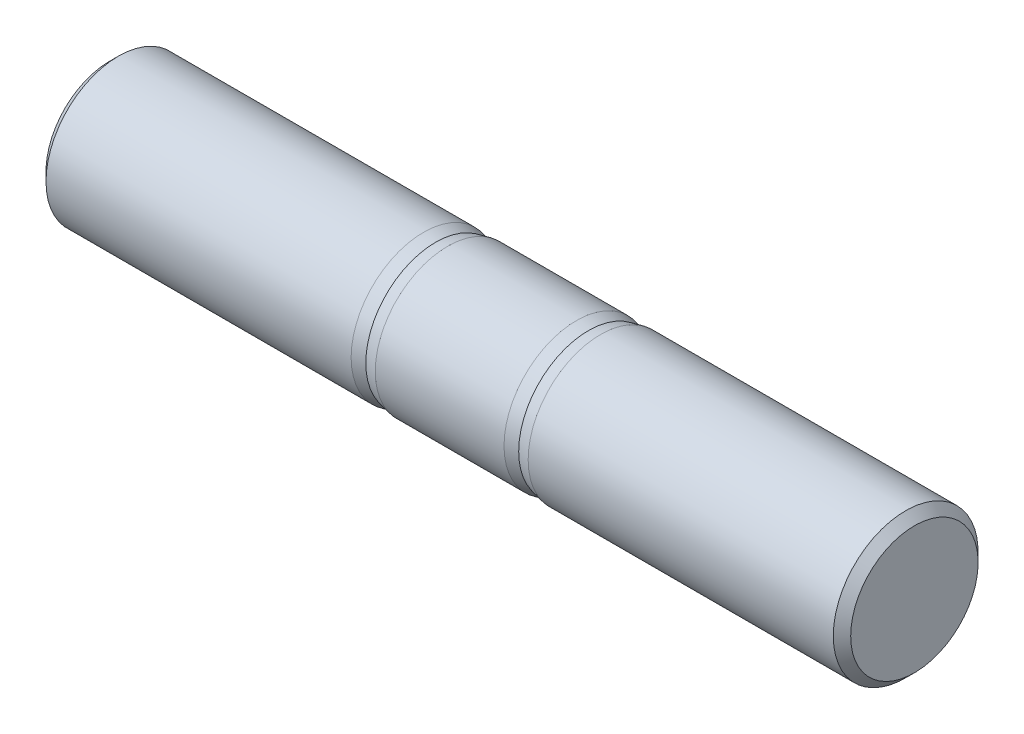
ISO-10303-21;
HEADER;
FILE_DESCRIPTION(('STEP AP214'),'2;1');
FILE_NAME('part.step','',(''),(''),'','','');
FILE_SCHEMA(('AUTOMOTIVE_DESIGN { 1 0 10303 214 1 1 1 1 }'));
ENDSEC;
DATA;
#1=APPLICATION_CONTEXT('core data for automotive mechanical design processes');
#2=APPLICATION_PROTOCOL_DEFINITION('international standard','automotive_design',2000,#1);
#3=PRODUCT_CONTEXT('',#1,'mechanical');
#4=PRODUCT('Part','Part','',(#3));
#5=PRODUCT_RELATED_PRODUCT_CATEGORY('part','',(#4));
#6=PRODUCT_DEFINITION_FORMATION('','',#4);
#7=PRODUCT_DEFINITION_CONTEXT('part definition',#1,'design');
#8=PRODUCT_DEFINITION('design','',#6,#7);
#9=PRODUCT_DEFINITION_SHAPE('','',#8);
#10=(LENGTH_UNIT() NAMED_UNIT(*) SI_UNIT(.MILLI.,.METRE.));
#11=(NAMED_UNIT(*) PLANE_ANGLE_UNIT() SI_UNIT($,.RADIAN.));
#12=(NAMED_UNIT(*) SI_UNIT($,.STERADIAN.) SOLID_ANGLE_UNIT());
#13=UNCERTAINTY_MEASURE_WITH_UNIT(LENGTH_MEASURE(1.E-05),#10,'distance_accuracy_value','');
#14=(GEOMETRIC_REPRESENTATION_CONTEXT(3) GLOBAL_UNCERTAINTY_ASSIGNED_CONTEXT((#13)) GLOBAL_UNIT_ASSIGNED_CONTEXT((#10,
#11,#12)) REPRESENTATION_CONTEXT('',''));
#15=CARTESIAN_POINT('',(0.,0.,0.));
#16=DIRECTION('',(0.,0.,1.));
#17=DIRECTION('',(1.,0.,0.));
#18=AXIS2_PLACEMENT_3D('',#15,#16,#17);
#19=CARTESIAN_POINT('',(84.,0.,0.));
#20=DIRECTION('',(-1.,0.,0.));
#21=DIRECTION('',(0.,0.,1.));
#22=AXIS2_PLACEMENT_3D('',#19,#20,#21);
#23=CONICAL_SURFACE('',#22,16.701,0.213209443242072);
#24=CARTESIAN_POINT('',(78.,0.,0.));
#25=DIRECTION('',(-1.,0.,0.));
#26=DIRECTION('',(0.,0.,1.));
#27=AXIS2_PLACEMENT_3D('',#24,#25,#26);
#28=CIRCLE('',#27,18.);
#29=CARTESIAN_POINT('',(78.,0.,18.));
#30=VERTEX_POINT('',#29);
#31=EDGE_CURVE('E58',#30,#30,#28,.T.);
#32=ORIENTED_EDGE('',*,*,#31,.F.);
#33=EDGE_LOOP('',(#32));
#34=FACE_BOUND('',#33,.T.);
#35=CARTESIAN_POINT('',(81.,0.,0.));
#36=DIRECTION('',(1.,0.,0.));
#37=DIRECTION('',(0.,0.,-1.));
#38=AXIS2_PLACEMENT_3D('',#35,#36,#37);
#39=CIRCLE('',#38,17.3505);
#40=CARTESIAN_POINT('',(81.,0.,-17.3505));
#41=VERTEX_POINT('',#40);
#42=EDGE_CURVE('E10',#41,#41,#39,.T.);
#43=ORIENTED_EDGE('',*,*,#42,.F.);
#44=EDGE_LOOP('',(#43));
#45=FACE_BOUND('',#44,.T.);
#46=ADVANCED_FACE('F32',(#34,#45),#23,.T.);
#47=CARTESIAN_POINT('',(0.,0.,0.));
#48=DIRECTION('',(1.,0.,0.));
#49=DIRECTION('',(0.,0.,-1.));
#50=AXIS2_PLACEMENT_3D('',#47,#48,#49);
#51=PLANE('',#50);
#52=CARTESIAN_POINT('',(0.,0.,0.));
#53=DIRECTION('',(1.,0.,0.));
#54=DIRECTION('',(0.,0.,-1.));
#55=AXIS2_PLACEMENT_3D('',#52,#53,#54);
#56=CIRCLE('',#55,15.835);
#57=CARTESIAN_POINT('',(0.,0.,-15.835));
#58=VERTEX_POINT('',#57);
#59=EDGE_CURVE('E55',#58,#58,#56,.F.);
#60=ORIENTED_EDGE('',*,*,#59,.T.);
#61=EDGE_LOOP('',(#60));
#62=FACE_BOUND('',#61,.T.);
#63=ADVANCED_FACE('F88',(#62),#51,.F.);
#64=CARTESIAN_POINT('',(-1.31084166351941,0.,0.));
#65=DIRECTION('',(-1.,0.,0.));
#66=DIRECTION('',(0.,0.,1.));
#67=AXIS2_PLACEMENT_3D('',#64,#65,#66);
#68=CYLINDRICAL_SURFACE('',#67,18.);
#69=CARTESIAN_POINT('',(2.16500000000003,0.,0.));
#70=DIRECTION('',(1.,0.,0.));
#71=DIRECTION('',(0.,0.,-1.));
#72=AXIS2_PLACEMENT_3D('',#69,#70,#71);
#73=CIRCLE('',#72,18.);
#74=CARTESIAN_POINT('',(2.16500000000003,0.,-18.));
#75=VERTEX_POINT('',#74);
#76=EDGE_CURVE('E52',#75,#75,#73,.T.);
#77=ORIENTED_EDGE('',*,*,#76,.T.);
#78=EDGE_LOOP('',(#77));
#79=FACE_BOUND('',#78,.T.);
#80=ORIENTED_EDGE('',*,*,#31,.T.);
#81=EDGE_LOOP('',(#80));
#82=FACE_BOUND('',#81,.T.);
#83=ADVANCED_FACE('F94',(#79,#82),#68,.T.);
#84=CARTESIAN_POINT('',(0.,0.,0.));
#85=DIRECTION('',(1.,0.,0.));
#86=DIRECTION('',(0.,0.,-1.));
#87=AXIS2_PLACEMENT_3D('',#84,#85,#86);
#88=CONICAL_SURFACE('',#87,15.835,0.785398163397443);
#89=ORIENTED_EDGE('',*,*,#76,.F.);
#90=EDGE_LOOP('',(#89));
#91=FACE_BOUND('',#90,.T.);
#92=ORIENTED_EDGE('',*,*,#59,.F.);
#93=EDGE_LOOP('',(#92));
#94=FACE_BOUND('',#93,.T.);
#95=ADVANCED_FACE('F84',(#91,#94),#88,.T.);
#96=CARTESIAN_POINT('',(84.,0.,0.));
#97=DIRECTION('',(1.,0.,0.));
#98=DIRECTION('',(0.,0.,-1.));
#99=AXIS2_PLACEMENT_3D('',#96,#97,#98);
#100=CONICAL_SURFACE('',#99,18.,0.213209443242074);
#101=CARTESIAN_POINT('',(84.,0.,0.));
#102=DIRECTION('',(-1.,0.,0.));
#103=DIRECTION('',(0.,0.,1.));
#104=AXIS2_PLACEMENT_3D('',#101,#102,#103);
#105=CIRCLE('',#104,18.);
#106=CARTESIAN_POINT('',(84.,0.,18.));
#107=VERTEX_POINT('',#106);
#108=EDGE_CURVE('E64',#107,#107,#105,.T.);
#109=ORIENTED_EDGE('',*,*,#108,.T.);
#110=EDGE_LOOP('',(#109));
#111=FACE_BOUND('',#110,.T.);
#112=ORIENTED_EDGE('',*,*,#42,.T.);
#113=EDGE_LOOP('',(#112));
#114=FACE_BOUND('',#113,.T.);
#115=ADVANCED_FACE('F75',(#111,#114),#100,.T.);
#116=CARTESIAN_POINT('',(122.,0.,0.));
#117=DIRECTION('',(-1.,0.,0.));
#118=DIRECTION('',(0.,0.,1.));
#119=AXIS2_PLACEMENT_3D('',#116,#117,#118);
#120=CONICAL_SURFACE('',#119,16.701,0.213209443242073);
#121=CARTESIAN_POINT('',(116.,0.,0.));
#122=DIRECTION('',(-1.,0.,0.));
#123=DIRECTION('',(0.,0.,1.));
#124=AXIS2_PLACEMENT_3D('',#121,#122,#123);
#125=CIRCLE('',#124,18.);
#126=CARTESIAN_POINT('',(116.,0.,18.));
#127=VERTEX_POINT('',#126);
#128=EDGE_CURVE('E67',#127,#127,#125,.T.);
#129=ORIENTED_EDGE('',*,*,#128,.F.);
#130=EDGE_LOOP('',(#129));
#131=FACE_BOUND('',#130,.T.);
#132=CARTESIAN_POINT('',(119.,0.,0.));
#133=DIRECTION('',(-1.,0.,0.));
#134=DIRECTION('',(0.,0.,1.));
#135=AXIS2_PLACEMENT_3D('',#132,#133,#134);
#136=CIRCLE('',#135,17.3505);
#137=CARTESIAN_POINT('',(119.,0.,17.3505));
#138=VERTEX_POINT('',#137);
#139=EDGE_CURVE('E39',#138,#138,#136,.T.);
#140=ORIENTED_EDGE('',*,*,#139,.T.);
#141=EDGE_LOOP('',(#140));
#142=FACE_BOUND('',#141,.T.);
#143=ADVANCED_FACE('F73',(#131,#142),#120,.T.);
#144=CARTESIAN_POINT('',(-7.80908694214528,0.,0.));
#145=DIRECTION('',(-1.,0.,0.));
#146=DIRECTION('',(0.,0.,1.));
#147=AXIS2_PLACEMENT_3D('',#144,#145,#146);
#148=CYLINDRICAL_SURFACE('',#147,18.);
#149=ORIENTED_EDGE('',*,*,#108,.F.);
#150=EDGE_LOOP('',(#149));
#151=FACE_BOUND('',#150,.T.);
#152=ORIENTED_EDGE('',*,*,#128,.T.);
#153=EDGE_LOOP('',(#152));
#154=FACE_BOUND('',#153,.T.);
#155=ADVANCED_FACE('F71',(#151,#154),#148,.T.);
#156=CARTESIAN_POINT('',(200.,18.,0.));
#157=DIRECTION('',(-1.,0.,0.));
#158=DIRECTION('',(0.,0.,1.));
#159=AXIS2_PLACEMENT_3D('',#156,#157,#158);
#160=PLANE('',#159);
#161=CARTESIAN_POINT('',(200.,0.,0.));
#162=DIRECTION('',(-1.,0.,0.));
#163=DIRECTION('',(0.,0.,1.));
#164=AXIS2_PLACEMENT_3D('',#161,#162,#163);
#165=CIRCLE('',#164,15.8350000000001);
#166=CARTESIAN_POINT('',(200.,0.,15.8350000000001));
#167=VERTEX_POINT('',#166);
#168=EDGE_CURVE('E43',#167,#167,#165,.F.);
#169=ORIENTED_EDGE('',*,*,#168,.T.);
#170=EDGE_LOOP('',(#169));
#171=FACE_BOUND('',#170,.T.);
#172=ADVANCED_FACE('F81',(#171),#160,.F.);
#173=CARTESIAN_POINT('',(197.835,0.,0.));
#174=DIRECTION('',(-1.,0.,0.));
#175=DIRECTION('',(0.,0.,1.));
#176=AXIS2_PLACEMENT_3D('',#173,#174,#175);
#177=CONICAL_SURFACE('',#176,18.,0.785398163397444);
#178=ORIENTED_EDGE('',*,*,#168,.F.);
#179=EDGE_LOOP('',(#178));
#180=FACE_BOUND('',#179,.T.);
#181=CARTESIAN_POINT('',(197.835,0.,0.));
#182=DIRECTION('',(-1.,0.,0.));
#183=DIRECTION('',(0.,0.,1.));
#184=AXIS2_PLACEMENT_3D('',#181,#182,#183);
#185=CIRCLE('',#184,18.);
#186=CARTESIAN_POINT('',(197.835,0.,18.));
#187=VERTEX_POINT('',#186);
#188=EDGE_CURVE('E47',#187,#187,#185,.T.);
#189=ORIENTED_EDGE('',*,*,#188,.F.);
#190=EDGE_LOOP('',(#189));
#191=FACE_BOUND('',#190,.T.);
#192=ADVANCED_FACE('F34',(#180,#191),#177,.T.);
#193=CARTESIAN_POINT('',(-1.31084166351941,0.,0.));
#194=DIRECTION('',(-1.,0.,0.));
#195=DIRECTION('',(0.,0.,1.));
#196=AXIS2_PLACEMENT_3D('',#193,#194,#195);
#197=CYLINDRICAL_SURFACE('',#196,18.);
#198=ORIENTED_EDGE('',*,*,#188,.T.);
#199=EDGE_LOOP('',(#198));
#200=FACE_BOUND('',#199,.T.);
#201=CARTESIAN_POINT('',(122.,0.,0.));
#202=DIRECTION('',(-1.,0.,0.));
#203=DIRECTION('',(0.,0.,1.));
#204=AXIS2_PLACEMENT_3D('',#201,#202,#203);
#205=CIRCLE('',#204,18.);
#206=CARTESIAN_POINT('',(122.,0.,18.));
#207=VERTEX_POINT('',#206);
#208=EDGE_CURVE('E61',#207,#207,#205,.T.);
#209=ORIENTED_EDGE('',*,*,#208,.F.);
#210=EDGE_LOOP('',(#209));
#211=FACE_BOUND('',#210,.T.);
#212=ADVANCED_FACE('F142',(#200,#211),#197,.T.);
#213=CARTESIAN_POINT('',(122.,0.,0.));
#214=DIRECTION('',(1.,0.,0.));
#215=DIRECTION('',(0.,0.,-1.));
#216=AXIS2_PLACEMENT_3D('',#213,#214,#215);
#217=CONICAL_SURFACE('',#216,18.,0.213209443242073);
#218=ORIENTED_EDGE('',*,*,#208,.T.);
#219=EDGE_LOOP('',(#218));
#220=FACE_BOUND('',#219,.T.);
#221=ORIENTED_EDGE('',*,*,#139,.F.);
#222=EDGE_LOOP('',(#221));
#223=FACE_BOUND('',#222,.T.);
#224=ADVANCED_FACE('F101',(#220,#223),#217,.T.);
#225=CLOSED_SHELL('',(#46,#63,#83,#95,#115,#143,#155,#172,#192,#212,#224));
#226=MANIFOLD_SOLID_BREP('B2',#225);
#227=ADVANCED_BREP_SHAPE_REPRESENTATION('',(#18,#226),#14);
#228=SHAPE_DEFINITION_REPRESENTATION(#9,#227);
ENDSEC;
END-ISO-10303-21;
